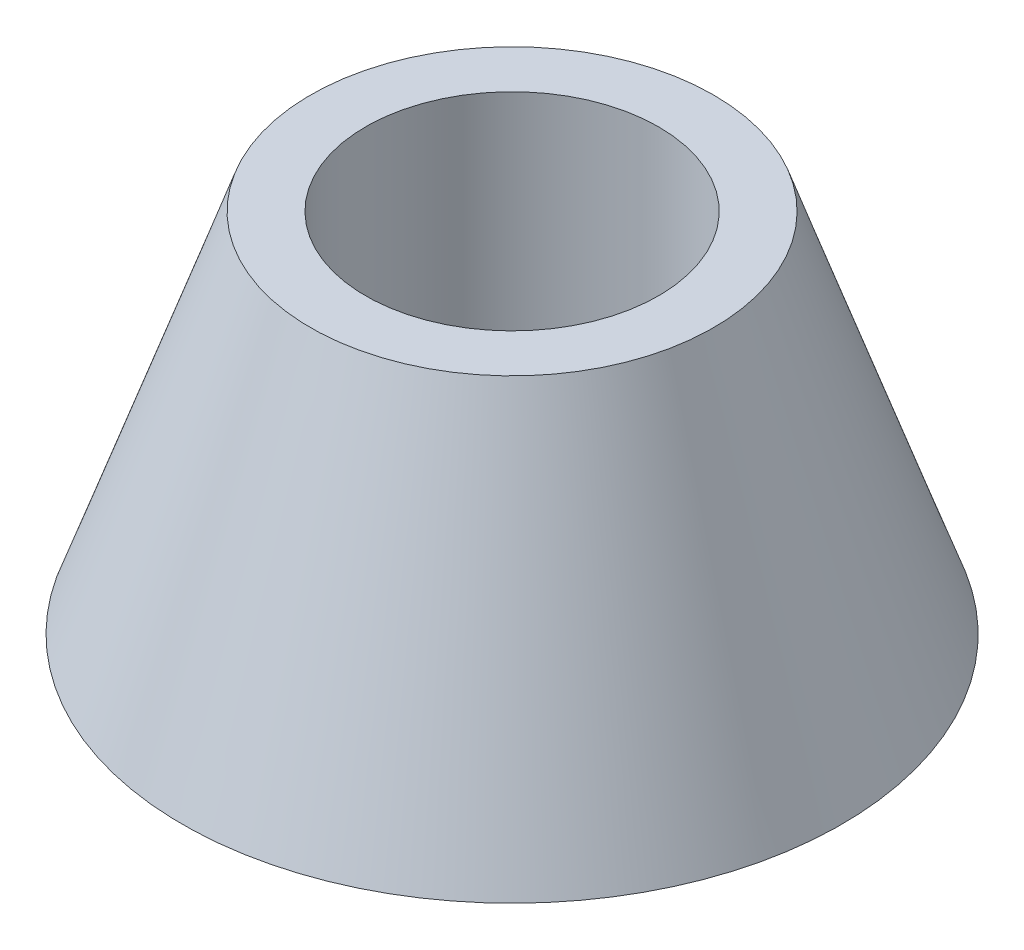
ISO-10303-21;
HEADER;
FILE_DESCRIPTION(('STEP AP214'),'2;1');
FILE_NAME('part.step','',(''),(''),'','','');
FILE_SCHEMA(('AUTOMOTIVE_DESIGN { 1 0 10303 214 1 1 1 1 }'));
ENDSEC;
DATA;
#1=APPLICATION_CONTEXT('core data for automotive mechanical design processes');
#2=APPLICATION_PROTOCOL_DEFINITION('international standard','automotive_design',2000,#1);
#3=PRODUCT_CONTEXT('',#1,'mechanical');
#4=PRODUCT('Part','Part','',(#3));
#5=PRODUCT_RELATED_PRODUCT_CATEGORY('part','',(#4));
#6=PRODUCT_DEFINITION_FORMATION('','',#4);
#7=PRODUCT_DEFINITION_CONTEXT('part definition',#1,'design');
#8=PRODUCT_DEFINITION('design','',#6,#7);
#9=PRODUCT_DEFINITION_SHAPE('','',#8);
#10=(LENGTH_UNIT() NAMED_UNIT(*) SI_UNIT(.MILLI.,.METRE.));
#11=(NAMED_UNIT(*) PLANE_ANGLE_UNIT() SI_UNIT($,.RADIAN.));
#12=(NAMED_UNIT(*) SI_UNIT($,.STERADIAN.) SOLID_ANGLE_UNIT());
#13=UNCERTAINTY_MEASURE_WITH_UNIT(LENGTH_MEASURE(1.E-05),#10,'distance_accuracy_value','');
#14=(GEOMETRIC_REPRESENTATION_CONTEXT(3) GLOBAL_UNCERTAINTY_ASSIGNED_CONTEXT((#13)) GLOBAL_UNIT_ASSIGNED_CONTEXT((#10,
#11,#12)) REPRESENTATION_CONTEXT('',''));
#15=CARTESIAN_POINT('',(0.,0.,0.));
#16=DIRECTION('',(0.,0.,1.));
#17=DIRECTION('',(1.,0.,0.));
#18=AXIS2_PLACEMENT_3D('',#15,#16,#17);
#19=CARTESIAN_POINT('',(-7.14375,0.,0.));
#20=DIRECTION('',(0.,1.,0.));
#21=DIRECTION('',(0.,0.,1.));
#22=AXIS2_PLACEMENT_3D('',#19,#20,#21);
#23=PLANE('',#22);
#24=CARTESIAN_POINT('',(0.,0.,0.));
#25=DIRECTION('',(0.,-1.,0.));
#26=DIRECTION('',(0.,0.,-1.));
#27=AXIS2_PLACEMENT_3D('',#24,#25,#26);
#28=CIRCLE('',#27,3.175);
#29=CARTESIAN_POINT('',(0.,0.,-3.175));
#30=VERTEX_POINT('',#29);
#31=EDGE_CURVE('E54',#30,#30,#28,.T.);
#32=ORIENTED_EDGE('',*,*,#31,.F.);
#33=EDGE_LOOP('',(#32));
#34=FACE_BOUND('',#33,.T.);
#35=CARTESIAN_POINT('',(0.,0.,0.));
#36=DIRECTION('',(0.,-1.,0.));
#37=DIRECTION('',(0.,0.,-1.));
#38=AXIS2_PLACEMENT_3D('',#35,#36,#37);
#39=CIRCLE('',#38,7.14375);
#40=CARTESIAN_POINT('',(0.,0.,-7.14375));
#41=VERTEX_POINT('',#40);
#42=EDGE_CURVE('E10',#41,#41,#39,.T.);
#43=ORIENTED_EDGE('',*,*,#42,.T.);
#44=EDGE_LOOP('',(#43));
#45=FACE_BOUND('',#44,.T.);
#46=ADVANCED_FACE('F36',(#34,#45),#23,.F.);
#47=CARTESIAN_POINT('',(0.,7.9375,0.));
#48=DIRECTION('',(0.,-1.,0.));
#49=DIRECTION('',(0.,0.,-1.));
#50=AXIS2_PLACEMENT_3D('',#47,#48,#49);
#51=CONICAL_SURFACE('',#50,4.3688,0.336318427513296);
#52=ORIENTED_EDGE('',*,*,#42,.F.);
#53=EDGE_LOOP('',(#52));
#54=FACE_BOUND('',#53,.T.);
#55=CARTESIAN_POINT('',(0.,7.9375,0.));
#56=DIRECTION('',(0.,-1.,0.));
#57=DIRECTION('',(0.,0.,-1.));
#58=AXIS2_PLACEMENT_3D('',#55,#56,#57);
#59=CIRCLE('',#58,4.3688);
#60=CARTESIAN_POINT('',(0.,7.9375,-4.3688));
#61=VERTEX_POINT('',#60);
#62=EDGE_CURVE('E43',#61,#61,#59,.T.);
#63=ORIENTED_EDGE('',*,*,#62,.T.);
#64=EDGE_LOOP('',(#63));
#65=FACE_BOUND('',#64,.T.);
#66=ADVANCED_FACE('F63',(#54,#65),#51,.T.);
#67=CARTESIAN_POINT('',(-4.3688,7.9375,0.));
#68=DIRECTION('',(0.,-1.,0.));
#69=DIRECTION('',(0.,0.,-1.));
#70=AXIS2_PLACEMENT_3D('',#67,#68,#69);
#71=PLANE('',#70);
#72=ORIENTED_EDGE('',*,*,#62,.F.);
#73=EDGE_LOOP('',(#72));
#74=FACE_BOUND('',#73,.T.);
#75=CARTESIAN_POINT('',(0.,7.9375,0.));
#76=DIRECTION('',(0.,-1.,0.));
#77=DIRECTION('',(0.,0.,-1.));
#78=AXIS2_PLACEMENT_3D('',#75,#76,#77);
#79=CIRCLE('',#78,3.175);
#80=CARTESIAN_POINT('',(0.,7.9375,-3.175));
#81=VERTEX_POINT('',#80);
#82=EDGE_CURVE('E49',#81,#81,#79,.T.);
#83=ORIENTED_EDGE('',*,*,#82,.T.);
#84=EDGE_LOOP('',(#83));
#85=FACE_BOUND('',#84,.T.);
#86=ADVANCED_FACE('F67',(#74,#85),#71,.F.);
#87=CARTESIAN_POINT('',(0.,0.,0.));
#88=DIRECTION('',(0.,-1.,0.));
#89=DIRECTION('',(0.,0.,-1.));
#90=AXIS2_PLACEMENT_3D('',#87,#88,#89);
#91=CYLINDRICAL_SURFACE('',#90,3.175);
#92=ORIENTED_EDGE('',*,*,#82,.F.);
#93=EDGE_LOOP('',(#92));
#94=FACE_BOUND('',#93,.T.);
#95=ORIENTED_EDGE('',*,*,#31,.T.);
#96=EDGE_LOOP('',(#95));
#97=FACE_BOUND('',#96,.T.);
#98=ADVANCED_FACE('F60',(#94,#97),#91,.F.);
#99=CLOSED_SHELL('',(#46,#66,#86,#98));
#100=MANIFOLD_SOLID_BREP('B2',#99);
#101=ADVANCED_BREP_SHAPE_REPRESENTATION('',(#18,#100),#14);
#102=SHAPE_DEFINITION_REPRESENTATION(#9,#101);
ENDSEC;
END-ISO-10303-21;
